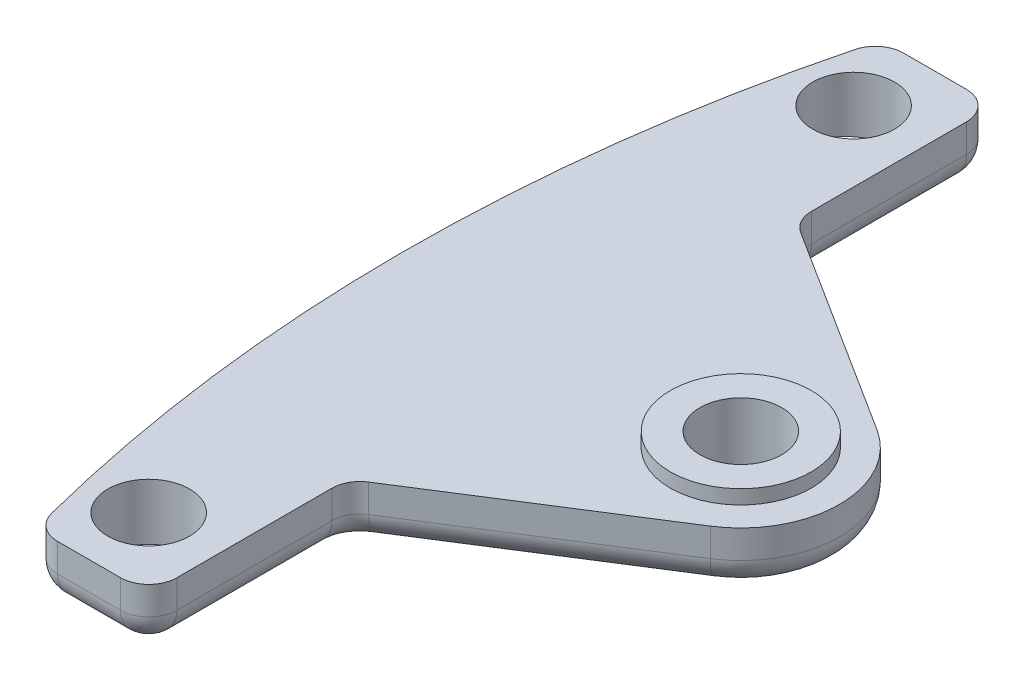
ISO-10303-21;
HEADER;
FILE_DESCRIPTION(('STEP AP214'),'2;1');
FILE_NAME('part.step','',(''),(''),'','','');
FILE_SCHEMA(('AUTOMOTIVE_DESIGN { 1 0 10303 214 1 1 1 1 }'));
ENDSEC;
DATA;
#1=APPLICATION_CONTEXT('core data for automotive mechanical design processes');
#2=APPLICATION_PROTOCOL_DEFINITION('international standard','automotive_design',2000,#1);
#3=PRODUCT_CONTEXT('',#1,'mechanical');
#4=PRODUCT('Part','Part','',(#3));
#5=PRODUCT_RELATED_PRODUCT_CATEGORY('part','',(#4));
#6=PRODUCT_DEFINITION_FORMATION('','',#4);
#7=PRODUCT_DEFINITION_CONTEXT('part definition',#1,'design');
#8=PRODUCT_DEFINITION('design','',#6,#7);
#9=PRODUCT_DEFINITION_SHAPE('','',#8);
#10=(LENGTH_UNIT() NAMED_UNIT(*) SI_UNIT(.MILLI.,.METRE.));
#11=(NAMED_UNIT(*) PLANE_ANGLE_UNIT() SI_UNIT($,.RADIAN.));
#12=(NAMED_UNIT(*) SI_UNIT($,.STERADIAN.) SOLID_ANGLE_UNIT());
#13=UNCERTAINTY_MEASURE_WITH_UNIT(LENGTH_MEASURE(1.E-05),#10,'distance_accuracy_value','');
#14=(GEOMETRIC_REPRESENTATION_CONTEXT(3) GLOBAL_UNCERTAINTY_ASSIGNED_CONTEXT((#13)) GLOBAL_UNIT_ASSIGNED_CONTEXT((#10,
#11,#12)) REPRESENTATION_CONTEXT('',''));
#15=CARTESIAN_POINT('',(0.,0.,0.));
#16=DIRECTION('',(0.,0.,1.));
#17=DIRECTION('',(1.,0.,0.));
#18=AXIS2_PLACEMENT_3D('',#15,#16,#17);
#19=CARTESIAN_POINT('',(0.,2.,0.));
#20=DIRECTION('',(0.,1.,0.));
#21=DIRECTION('',(0.,0.,1.));
#22=AXIS2_PLACEMENT_3D('',#19,#20,#21);
#23=PLANE('',#22);
#24=CARTESIAN_POINT('',(-8.5,2.,-12.5));
#25=DIRECTION('',(0.,1.,0.));
#26=DIRECTION('',(0.,0.,1.));
#27=AXIS2_PLACEMENT_3D('',#24,#25,#26);
#28=CIRCLE('',#27,1.45);
#29=CARTESIAN_POINT('',(-8.5,2.,-11.05));
#30=VERTEX_POINT('',#29);
#31=EDGE_CURVE('E234',#30,#30,#28,.T.);
#32=ORIENTED_EDGE('',*,*,#31,.F.);
#33=EDGE_LOOP('',(#32));
#34=FACE_BOUND('',#33,.T.);
#35=CARTESIAN_POINT('',(-8.5,2.,12.5));
#36=DIRECTION('',(0.,1.,0.));
#37=DIRECTION('',(0.,0.,1.));
#38=AXIS2_PLACEMENT_3D('',#35,#36,#37);
#39=CIRCLE('',#38,1.45);
#40=CARTESIAN_POINT('',(-8.5,2.,13.95));
#41=VERTEX_POINT('',#40);
#42=EDGE_CURVE('E523',#41,#41,#39,.T.);
#43=ORIENTED_EDGE('',*,*,#42,.F.);
#44=EDGE_LOOP('',(#43));
#45=FACE_BOUND('',#44,.T.);
#46=DIRECTION('',(1.,0.,0.));
#47=VECTOR('',#46,1.);
#48=CARTESIAN_POINT('',(-10.,2.,15.));
#49=LINE('',#48,#47);
#50=CARTESIAN_POINT('',(-9.22992749628068,2.,15.));
#51=VERTEX_POINT('',#50);
#52=CARTESIAN_POINT('',(-7.,2.,15.));
#53=VERTEX_POINT('',#52);
#54=EDGE_CURVE('E490',#51,#53,#49,.T.);
#55=ORIENTED_EDGE('',*,*,#54,.T.);
#56=CARTESIAN_POINT('',(-7.,2.,14.));
#57=DIRECTION('',(0.,1.,0.));
#58=DIRECTION('',(0.,0.,1.));
#59=AXIS2_PLACEMENT_3D('',#56,#57,#58);
#60=CIRCLE('',#59,1.);
#61=CARTESIAN_POINT('',(-6.,2.,14.));
#62=VERTEX_POINT('',#61);
#63=EDGE_CURVE('E310',#53,#62,#60,.T.);
#64=ORIENTED_EDGE('',*,*,#63,.T.);
#65=DIRECTION('',(0.,0.,-1.));
#66=VECTOR('',#65,1.);
#67=CARTESIAN_POINT('',(-6.,2.,15.));
#68=LINE('',#67,#66);
#69=CARTESIAN_POINT('',(-6.,2.,8.50448731510807));
#70=VERTEX_POINT('',#69);
#71=EDGE_CURVE('E495',#62,#70,#68,.T.);
#72=ORIENTED_EDGE('',*,*,#71,.T.);
#73=CARTESIAN_POINT('',(-5.,2.,8.50448731510807));
#74=DIRECTION('',(0.,1.,0.));
#75=DIRECTION('',(0.,0.,1.));
#76=AXIS2_PLACEMENT_3D('',#73,#74,#75);
#77=CIRCLE('',#76,1.);
#78=CARTESIAN_POINT('',(-5.53596548940221,2.,7.66024742374433));
#79=VERTEX_POINT('',#78);
#80=EDGE_CURVE('E55',#70,#79,#77,.F.);
#81=ORIENTED_EDGE('',*,*,#80,.T.);
#82=DIRECTION('',(0.844239891363734,0.,-0.53596548940221));
#83=VECTOR('',#82,1.);
#84=CARTESIAN_POINT('',(-6.,2.,7.95483961977326));
#85=LINE('',#84,#83);
#86=CARTESIAN_POINT('',(1.87587921290753,2.,2.95483961977326));
#87=VERTEX_POINT('',#86);
#88=EDGE_CURVE('E208',#79,#87,#85,.T.);
#89=ORIENTED_EDGE('',*,*,#88,.T.);
#90=CARTESIAN_POINT('',(0.,2.,0.));
#91=DIRECTION('',(0.,1.,0.));
#92=DIRECTION('',(0.,0.,1.));
#93=AXIS2_PLACEMENT_3D('',#90,#91,#92);
#94=CIRCLE('',#93,3.50000000000005);
#95=CARTESIAN_POINT('',(1.87587921290753,2.,-2.95483961977326));
#96=VERTEX_POINT('',#95);
#97=EDGE_CURVE('E202',#87,#96,#94,.T.);
#98=ORIENTED_EDGE('',*,*,#97,.T.);
#99=DIRECTION('',(-0.844239891363734,0.,-0.53596548940221));
#100=VECTOR('',#99,1.);
#101=CARTESIAN_POINT('',(1.87587921290753,2.,-2.95483961977326));
#102=LINE('',#101,#100);
#103=CARTESIAN_POINT('',(-5.53596548940221,2.,-7.66024742374434));
#104=VERTEX_POINT('',#103);
#105=EDGE_CURVE('E190',#96,#104,#102,.T.);
#106=ORIENTED_EDGE('',*,*,#105,.T.);
#107=CARTESIAN_POINT('',(-5.,2.,-8.50448731510807));
#108=DIRECTION('',(0.,1.,0.));
#109=DIRECTION('',(0.,0.,1.));
#110=AXIS2_PLACEMENT_3D('',#107,#108,#109);
#111=CIRCLE('',#110,1.);
#112=CARTESIAN_POINT('',(-6.,2.,-8.50448731510807));
#113=VERTEX_POINT('',#112);
#114=EDGE_CURVE('E11',#104,#113,#111,.F.);
#115=ORIENTED_EDGE('',*,*,#114,.T.);
#116=DIRECTION('',(0.,0.,-1.));
#117=VECTOR('',#116,1.);
#118=CARTESIAN_POINT('',(-6.,2.,-7.95483961977326));
#119=LINE('',#118,#117);
#120=CARTESIAN_POINT('',(-6.,2.,-14.));
#121=VERTEX_POINT('',#120);
#122=EDGE_CURVE('E201',#113,#121,#119,.T.);
#123=ORIENTED_EDGE('',*,*,#122,.T.);
#124=CARTESIAN_POINT('',(-7.,2.,-14.));
#125=DIRECTION('',(0.,1.,0.));
#126=DIRECTION('',(0.,0.,1.));
#127=AXIS2_PLACEMENT_3D('',#124,#125,#126);
#128=CIRCLE('',#127,1.);
#129=CARTESIAN_POINT('',(-7.,2.,-15.));
#130=VERTEX_POINT('',#129);
#131=EDGE_CURVE('E307',#121,#130,#128,.T.);
#132=ORIENTED_EDGE('',*,*,#131,.T.);
#133=DIRECTION('',(-1.,0.,0.));
#134=VECTOR('',#133,1.);
#135=CARTESIAN_POINT('',(-6.,2.,-15.));
#136=LINE('',#135,#134);
#137=CARTESIAN_POINT('',(-9.22992749628068,2.,-15.));
#138=VERTEX_POINT('',#137);
#139=EDGE_CURVE('E496',#130,#138,#136,.T.);
#140=ORIENTED_EDGE('',*,*,#139,.T.);
#141=CARTESIAN_POINT('',(-9.22992749628068,2.,-14.));
#142=DIRECTION('',(0.,1.,0.));
#143=DIRECTION('',(0.,0.,1.));
#144=AXIS2_PLACEMENT_3D('',#141,#142,#143);
#145=CIRCLE('',#144,1.);
#146=CARTESIAN_POINT('',(-10.198459540659,2.,-14.2488888888889));
#147=VERTEX_POINT('',#146);
#148=EDGE_CURVE('E301',#138,#147,#145,.T.);
#149=ORIENTED_EDGE('',*,*,#148,.T.);
#150=CARTESIAN_POINT('',(45.2500000000001,2.,0.));
#151=DIRECTION('',(0.,1.,0.));
#152=DIRECTION('',(0.,0.,1.));
#153=AXIS2_PLACEMENT_3D('',#150,#151,#152);
#154=CIRCLE('',#153,57.2500000000001);
#155=CARTESIAN_POINT('',(-10.198459540659,2.,14.2488888888889));
#156=VERTEX_POINT('',#155);
#157=EDGE_CURVE('E492',#147,#156,#154,.T.);
#158=ORIENTED_EDGE('',*,*,#157,.T.);
#159=CARTESIAN_POINT('',(-9.22992749628068,2.,14.));
#160=DIRECTION('',(0.,1.,0.));
#161=DIRECTION('',(0.,0.,1.));
#162=AXIS2_PLACEMENT_3D('',#159,#160,#161);
#163=CIRCLE('',#162,1.);
#164=EDGE_CURVE('E304',#156,#51,#163,.T.);
#165=ORIENTED_EDGE('',*,*,#164,.T.);
#166=EDGE_LOOP('',(#55,#64,#72,#81,#89,#98,#106,#115,#123,#132,#140,#149,#158,#165));
#167=FACE_BOUND('',#166,.T.);
#168=CARTESIAN_POINT('',(0.,2.,0.));
#169=DIRECTION('',(0.,1.,0.));
#170=DIRECTION('',(0.,0.,1.));
#171=AXIS2_PLACEMENT_3D('',#168,#169,#170);
#172=CIRCLE('',#171,2.5);
#173=CARTESIAN_POINT('',(0.,2.,2.5));
#174=VERTEX_POINT('',#173);
#175=EDGE_CURVE('E513',#174,#174,#172,.T.);
#176=ORIENTED_EDGE('',*,*,#175,.F.);
#177=EDGE_LOOP('',(#176));
#178=FACE_BOUND('',#177,.T.);
#179=ADVANCED_FACE('F45',(#34,#45,#167,#178),#23,.T.);
#180=CARTESIAN_POINT('',(0.,0.,0.));
#181=DIRECTION('',(0.,1.,0.));
#182=DIRECTION('',(0.,0.,1.));
#183=AXIS2_PLACEMENT_3D('',#180,#181,#182);
#184=PLANE('',#183);
#185=CARTESIAN_POINT('',(-8.5,0.,12.5));
#186=DIRECTION('',(0.,1.,0.));
#187=DIRECTION('',(0.,0.,1.));
#188=AXIS2_PLACEMENT_3D('',#185,#186,#187);
#189=CIRCLE('',#188,1.45);
#190=CARTESIAN_POINT('',(-9.3045551150355,0.,13.7063130053473));
#191=VERTEX_POINT('',#190);
#192=CARTESIAN_POINT('',(-9.75428223745297,0.,11.7724863789522));
#193=VERTEX_POINT('',#192);
#194=EDGE_CURVE('E229',#191,#193,#189,.T.);
#195=ORIENTED_EDGE('',*,*,#194,.T.);
#196=CARTESIAN_POINT('',(45.2500000000001,0.,0.));
#197=DIRECTION('',(0.,1.,0.));
#198=DIRECTION('',(0.,0.,1.));
#199=AXIS2_PLACEMENT_3D('',#196,#197,#198);
#200=CIRCLE('',#199,56.2500000000001);
#201=CARTESIAN_POINT('',(-9.75428223745296,0.,-11.7724863789523));
#202=VERTEX_POINT('',#201);
#203=EDGE_CURVE('E278',#193,#202,#200,.F.);
#204=ORIENTED_EDGE('',*,*,#203,.T.);
#205=CARTESIAN_POINT('',(-8.5,0.,-12.5));
#206=DIRECTION('',(0.,1.,0.));
#207=DIRECTION('',(0.,0.,1.));
#208=AXIS2_PLACEMENT_3D('',#205,#206,#207);
#209=CIRCLE('',#208,1.45);
#210=CARTESIAN_POINT('',(-9.30455511503549,0.,-13.7063130053474));
#211=VERTEX_POINT('',#210);
#212=EDGE_CURVE('E233',#202,#211,#209,.T.);
#213=ORIENTED_EDGE('',*,*,#212,.T.);
#214=CARTESIAN_POINT('',(45.2500000000001,0.,0.));
#215=DIRECTION('',(0.,1.,0.));
#216=DIRECTION('',(0.,0.,1.));
#217=AXIS2_PLACEMENT_3D('',#214,#215,#216);
#218=CIRCLE('',#217,56.2500000000001);
#219=CARTESIAN_POINT('',(-9.22992749628068,0.,-14.));
#220=VERTEX_POINT('',#219);
#221=EDGE_CURVE('E242',#211,#220,#218,.F.);
#222=ORIENTED_EDGE('',*,*,#221,.T.);
#223=DIRECTION('',(-1.,0.,0.));
#224=VECTOR('',#223,1.);
#225=CARTESIAN_POINT('',(0.,0.,-14.));
#226=LINE('',#225,#224);
#227=CARTESIAN_POINT('',(-7.,0.,-14.));
#228=VERTEX_POINT('',#227);
#229=EDGE_CURVE('E245',#220,#228,#226,.F.);
#230=ORIENTED_EDGE('',*,*,#229,.T.);
#231=DIRECTION('',(0.,0.,-1.));
#232=VECTOR('',#231,1.);
#233=CARTESIAN_POINT('',(-7.,0.,0.));
#234=LINE('',#233,#232);
#235=CARTESIAN_POINT('',(-7.,0.,-8.50448731510807));
#236=VERTEX_POINT('',#235);
#237=EDGE_CURVE('E248',#228,#236,#234,.F.);
#238=ORIENTED_EDGE('',*,*,#237,.T.);
#239=CARTESIAN_POINT('',(-5.,0.,-8.50448731510807));
#240=DIRECTION('',(0.,1.,0.));
#241=DIRECTION('',(0.,0.,1.));
#242=AXIS2_PLACEMENT_3D('',#239,#240,#241);
#243=CIRCLE('',#242,2.);
#244=CARTESIAN_POINT('',(-6.07193097880442,0.,-6.8160075323806));
#245=VERTEX_POINT('',#244);
#246=EDGE_CURVE('E251',#245,#236,#243,.F.);
#247=ORIENTED_EDGE('',*,*,#246,.F.);
#248=DIRECTION('',(-0.844239891363734,0.,-0.53596548940221));
#249=VECTOR('',#248,1.);
#250=CARTESIAN_POINT('',(1.33991372350555,0.,-2.11059972840938));
#251=LINE('',#250,#249);
#252=CARTESIAN_POINT('',(1.33991372350538,0.,-2.11059972840948));
#253=VERTEX_POINT('',#252);
#254=EDGE_CURVE('E255',#245,#253,#251,.F.);
#255=ORIENTED_EDGE('',*,*,#254,.T.);
#256=CARTESIAN_POINT('',(0.,0.,0.));
#257=DIRECTION('',(0.,1.,0.));
#258=DIRECTION('',(0.,0.,1.));
#259=AXIS2_PLACEMENT_3D('',#256,#257,#258);
#260=CIRCLE('',#259,2.50000000000005);
#261=CARTESIAN_POINT('',(1.33991372350532,0.,2.11059972840952));
#262=VERTEX_POINT('',#261);
#263=EDGE_CURVE('E258',#253,#262,#260,.F.);
#264=ORIENTED_EDGE('',*,*,#263,.T.);
#265=DIRECTION('',(0.844239891363734,0.,-0.53596548940221));
#266=VECTOR('',#265,1.);
#267=CARTESIAN_POINT('',(1.33991372350555,0.,2.11059972840937));
#268=LINE('',#267,#266);
#269=CARTESIAN_POINT('',(-6.07193097880442,0.,6.8160075323806));
#270=VERTEX_POINT('',#269);
#271=EDGE_CURVE('E261',#262,#270,#268,.F.);
#272=ORIENTED_EDGE('',*,*,#271,.T.);
#273=CARTESIAN_POINT('',(-5.,0.,8.50448731510807));
#274=DIRECTION('',(0.,1.,0.));
#275=DIRECTION('',(0.,0.,1.));
#276=AXIS2_PLACEMENT_3D('',#273,#274,#275);
#277=CIRCLE('',#276,2.);
#278=CARTESIAN_POINT('',(-7.,0.,8.50448731510807));
#279=VERTEX_POINT('',#278);
#280=EDGE_CURVE('E265',#279,#270,#277,.F.);
#281=ORIENTED_EDGE('',*,*,#280,.F.);
#282=DIRECTION('',(0.,0.,-1.));
#283=VECTOR('',#282,1.);
#284=CARTESIAN_POINT('',(-7.,0.,0.));
#285=LINE('',#284,#283);
#286=CARTESIAN_POINT('',(-7.,0.,14.));
#287=VERTEX_POINT('',#286);
#288=EDGE_CURVE('E269',#279,#287,#285,.F.);
#289=ORIENTED_EDGE('',*,*,#288,.T.);
#290=DIRECTION('',(1.,0.,0.));
#291=VECTOR('',#290,1.);
#292=CARTESIAN_POINT('',(0.,0.,14.));
#293=LINE('',#292,#291);
#294=CARTESIAN_POINT('',(-9.22992749628068,0.,14.));
#295=VERTEX_POINT('',#294);
#296=EDGE_CURVE('E272',#287,#295,#293,.F.);
#297=ORIENTED_EDGE('',*,*,#296,.T.);
#298=CARTESIAN_POINT('',(45.2500000000001,0.,0.));
#299=DIRECTION('',(0.,1.,0.));
#300=DIRECTION('',(0.,0.,1.));
#301=AXIS2_PLACEMENT_3D('',#298,#299,#300);
#302=CIRCLE('',#301,56.2500000000001);
#303=EDGE_CURVE('E275',#295,#191,#302,.F.);
#304=ORIENTED_EDGE('',*,*,#303,.T.);
#305=EDGE_LOOP('',(#195,#204,#213,#222,#230,#238,#247,#255,#264,#272,#281,#289,#297,#304));
#306=FACE_BOUND('',#305,.T.);
#307=CARTESIAN_POINT('',(0.,0.,0.));
#308=DIRECTION('',(0.,1.,0.));
#309=DIRECTION('',(0.,0.,1.));
#310=AXIS2_PLACEMENT_3D('',#307,#308,#309);
#311=CIRCLE('',#310,1.45);
#312=CARTESIAN_POINT('',(0.,0.,1.45));
#313=VERTEX_POINT('',#312);
#314=EDGE_CURVE('E213',#313,#313,#311,.T.);
#315=ORIENTED_EDGE('',*,*,#314,.T.);
#316=EDGE_LOOP('',(#315));
#317=FACE_BOUND('',#316,.T.);
#318=ADVANCED_FACE('F385',(#306,#317),#184,.F.);
#319=CARTESIAN_POINT('',(0.,2.,0.));
#320=DIRECTION('',(0.,-1.,0.));
#321=DIRECTION('',(0.,0.,-1.));
#322=AXIS2_PLACEMENT_3D('',#319,#320,#321);
#323=CYLINDRICAL_SURFACE('',#322,3.50000000000005);
#324=DIRECTION('',(0.,-1.,0.));
#325=VECTOR('',#324,1.);
#326=CARTESIAN_POINT('',(1.87587921290753,2.,2.95483961977326));
#327=LINE('',#326,#325);
#328=CARTESIAN_POINT('',(1.87587921290753,1.,2.95483961977326));
#329=VERTEX_POINT('',#328);
#330=EDGE_CURVE('E220',#87,#329,#327,.T.);
#331=ORIENTED_EDGE('',*,*,#330,.T.);
#332=CARTESIAN_POINT('',(0.,1.,0.));
#333=DIRECTION('',(0.,1.,0.));
#334=DIRECTION('',(0.,0.,1.));
#335=AXIS2_PLACEMENT_3D('',#332,#333,#334);
#336=CIRCLE('',#335,3.50000000000005);
#337=CARTESIAN_POINT('',(1.87587921290753,1.,-2.95483961977326));
#338=VERTEX_POINT('',#337);
#339=EDGE_CURVE('E217',#329,#338,#336,.T.);
#340=ORIENTED_EDGE('',*,*,#339,.T.);
#341=DIRECTION('',(0.,-1.,0.));
#342=VECTOR('',#341,1.);
#343=CARTESIAN_POINT('',(1.87587921290753,2.,-2.95483961977326));
#344=LINE('',#343,#342);
#345=EDGE_CURVE('E194',#96,#338,#344,.T.);
#346=ORIENTED_EDGE('',*,*,#345,.F.);
#347=ORIENTED_EDGE('',*,*,#97,.F.);
#348=EDGE_LOOP('',(#331,#340,#346,#347));
#349=FACE_BOUND('',#348,.T.);
#350=ADVANCED_FACE('F215',(#349),#323,.T.);
#351=CARTESIAN_POINT('',(1.87587921290753,2.,-2.95483961977326));
#352=DIRECTION('',(-0.53596548940221,0.,0.844239891363734));
#353=DIRECTION('',(0.844239891363734,0.,0.53596548940221));
#354=AXIS2_PLACEMENT_3D('',#351,#352,#353);
#355=PLANE('',#354);
#356=DIRECTION('',(-0.844239891363734,0.,-0.53596548940221));
#357=VECTOR('',#356,1.);
#358=CARTESIAN_POINT('',(1.87587921290753,1.,-2.95483961977326));
#359=LINE('',#358,#357);
#360=CARTESIAN_POINT('',(-5.53596548940221,1.,-7.66024742374434));
#361=VERTEX_POINT('',#360);
#362=EDGE_CURVE('E322',#338,#361,#359,.T.);
#363=ORIENTED_EDGE('',*,*,#362,.T.);
#364=DIRECTION('',(0.,-1.,0.));
#365=VECTOR('',#364,1.);
#366=CARTESIAN_POINT('',(-5.53596548940221,2.,-7.66024742374434));
#367=LINE('',#366,#365);
#368=EDGE_CURVE('E197',#361,#104,#367,.F.);
#369=ORIENTED_EDGE('',*,*,#368,.T.);
#370=ORIENTED_EDGE('',*,*,#105,.F.);
#371=ORIENTED_EDGE('',*,*,#345,.T.);
#372=EDGE_LOOP('',(#363,#369,#370,#371));
#373=FACE_BOUND('',#372,.T.);
#374=ADVANCED_FACE('F192',(#373),#355,.F.);
#375=CARTESIAN_POINT('',(-6.,2.,-7.95483961977326));
#376=DIRECTION('',(-1.,0.,0.));
#377=DIRECTION('',(0.,0.,1.));
#378=AXIS2_PLACEMENT_3D('',#375,#376,#377);
#379=PLANE('',#378);
#380=ORIENTED_EDGE('',*,*,#122,.F.);
#381=DIRECTION('',(0.,-1.,0.));
#382=VECTOR('',#381,1.);
#383=CARTESIAN_POINT('',(-6.,0.,-8.50448731510807));
#384=LINE('',#383,#382);
#385=CARTESIAN_POINT('',(-6.,1.,-8.50448731510807));
#386=VERTEX_POINT('',#385);
#387=EDGE_CURVE('E319',#113,#386,#384,.T.);
#388=ORIENTED_EDGE('',*,*,#387,.T.);
#389=DIRECTION('',(0.,0.,-1.));
#390=VECTOR('',#389,1.);
#391=CARTESIAN_POINT('',(-6.,1.,-7.95483961977326));
#392=LINE('',#391,#390);
#393=CARTESIAN_POINT('',(-6.,1.,-14.));
#394=VERTEX_POINT('',#393);
#395=EDGE_CURVE('E316',#386,#394,#392,.T.);
#396=ORIENTED_EDGE('',*,*,#395,.T.);
#397=DIRECTION('',(0.,-1.,0.));
#398=VECTOR('',#397,1.);
#399=CARTESIAN_POINT('',(-6.,2.,-14.));
#400=LINE('',#399,#398);
#401=EDGE_CURVE('E313',#394,#121,#400,.F.);
#402=ORIENTED_EDGE('',*,*,#401,.T.);
#403=EDGE_LOOP('',(#380,#388,#396,#402));
#404=FACE_BOUND('',#403,.T.);
#405=ADVANCED_FACE('F404',(#404),#379,.F.);
#406=CARTESIAN_POINT('',(-6.,2.,-15.));
#407=DIRECTION('',(0.,0.,1.));
#408=DIRECTION('',(1.,0.,0.));
#409=AXIS2_PLACEMENT_3D('',#406,#407,#408);
#410=PLANE('',#409);
#411=ORIENTED_EDGE('',*,*,#139,.F.);
#412=DIRECTION('',(0.,-1.,0.));
#413=VECTOR('',#412,1.);
#414=CARTESIAN_POINT('',(-7.,2.,-15.));
#415=LINE('',#414,#413);
#416=CARTESIAN_POINT('',(-7.,1.,-15.));
#417=VERTEX_POINT('',#416);
#418=EDGE_CURVE('E333',#130,#417,#415,.T.);
#419=ORIENTED_EDGE('',*,*,#418,.T.);
#420=DIRECTION('',(-1.,0.,0.));
#421=VECTOR('',#420,1.);
#422=CARTESIAN_POINT('',(-6.,1.,-15.));
#423=LINE('',#422,#421);
#424=CARTESIAN_POINT('',(-9.22992749628068,1.,-15.));
#425=VERTEX_POINT('',#424);
#426=EDGE_CURVE('E327',#417,#425,#423,.T.);
#427=ORIENTED_EDGE('',*,*,#426,.T.);
#428=DIRECTION('',(0.,-1.,0.));
#429=VECTOR('',#428,1.);
#430=CARTESIAN_POINT('',(-9.22992749628068,2.,-15.));
#431=LINE('',#430,#429);
#432=EDGE_CURVE('E330',#425,#138,#431,.F.);
#433=ORIENTED_EDGE('',*,*,#432,.T.);
#434=EDGE_LOOP('',(#411,#419,#427,#433));
#435=FACE_BOUND('',#434,.T.);
#436=ADVANCED_FACE('F400',(#435),#410,.F.);
#437=CARTESIAN_POINT('',(-10.,2.,15.));
#438=DIRECTION('',(0.,0.,-1.));
#439=DIRECTION('',(-1.,0.,0.));
#440=AXIS2_PLACEMENT_3D('',#437,#438,#439);
#441=PLANE('',#440);
#442=DIRECTION('',(1.,0.,0.));
#443=VECTOR('',#442,1.);
#444=CARTESIAN_POINT('',(-10.,1.,15.));
#445=LINE('',#444,#443);
#446=CARTESIAN_POINT('',(-9.22992749628068,1.,15.));
#447=VERTEX_POINT('',#446);
#448=CARTESIAN_POINT('',(-7.,1.,15.));
#449=VERTEX_POINT('',#448);
#450=EDGE_CURVE('E292',#447,#449,#445,.T.);
#451=ORIENTED_EDGE('',*,*,#450,.T.);
#452=DIRECTION('',(0.,-1.,0.));
#453=VECTOR('',#452,1.);
#454=CARTESIAN_POINT('',(-7.,2.,15.));
#455=LINE('',#454,#453);
#456=EDGE_CURVE('E298',#449,#53,#455,.F.);
#457=ORIENTED_EDGE('',*,*,#456,.T.);
#458=ORIENTED_EDGE('',*,*,#54,.F.);
#459=DIRECTION('',(0.,-1.,0.));
#460=VECTOR('',#459,1.);
#461=CARTESIAN_POINT('',(-9.22992749628068,0.,15.));
#462=LINE('',#461,#460);
#463=EDGE_CURVE('E295',#51,#447,#462,.T.);
#464=ORIENTED_EDGE('',*,*,#463,.T.);
#465=EDGE_LOOP('',(#451,#457,#458,#464));
#466=FACE_BOUND('',#465,.T.);
#467=ADVANCED_FACE('F396',(#466),#441,.F.);
#468=CARTESIAN_POINT('',(-6.,2.,15.));
#469=DIRECTION('',(-1.,0.,0.));
#470=DIRECTION('',(0.,0.,1.));
#471=AXIS2_PLACEMENT_3D('',#468,#469,#470);
#472=PLANE('',#471);
#473=ORIENTED_EDGE('',*,*,#71,.F.);
#474=DIRECTION('',(0.,-1.,0.));
#475=VECTOR('',#474,1.);
#476=CARTESIAN_POINT('',(-6.,2.,14.));
#477=LINE('',#476,#475);
#478=CARTESIAN_POINT('',(-6.,1.,14.));
#479=VERTEX_POINT('',#478);
#480=EDGE_CURVE('E289',#62,#479,#477,.T.);
#481=ORIENTED_EDGE('',*,*,#480,.T.);
#482=DIRECTION('',(0.,0.,-1.));
#483=VECTOR('',#482,1.);
#484=CARTESIAN_POINT('',(-6.,1.,15.));
#485=LINE('',#484,#483);
#486=CARTESIAN_POINT('',(-6.,1.,8.50448731510807));
#487=VERTEX_POINT('',#486);
#488=EDGE_CURVE('E286',#479,#487,#485,.T.);
#489=ORIENTED_EDGE('',*,*,#488,.T.);
#490=DIRECTION('',(0.,-1.,0.));
#491=VECTOR('',#490,1.);
#492=CARTESIAN_POINT('',(-6.,2.,8.50448731510807));
#493=LINE('',#492,#491);
#494=EDGE_CURVE('E283',#487,#70,#493,.F.);
#495=ORIENTED_EDGE('',*,*,#494,.T.);
#496=EDGE_LOOP('',(#473,#481,#489,#495));
#497=FACE_BOUND('',#496,.T.);
#498=ADVANCED_FACE('F392',(#497),#472,.F.);
#499=CARTESIAN_POINT('',(-6.,2.,7.95483961977326));
#500=DIRECTION('',(-0.53596548940221,0.,-0.844239891363734));
#501=DIRECTION('',(-0.844239891363734,0.,0.53596548940221));
#502=AXIS2_PLACEMENT_3D('',#499,#500,#501);
#503=PLANE('',#502);
#504=DIRECTION('',(0.,-1.,0.));
#505=VECTOR('',#504,1.);
#506=CARTESIAN_POINT('',(-5.53596548940221,0.,7.66024742374433));
#507=LINE('',#506,#505);
#508=CARTESIAN_POINT('',(-5.53596548940221,1.,7.66024742374433));
#509=VERTEX_POINT('',#508);
#510=EDGE_CURVE('E219',#79,#509,#507,.T.);
#511=ORIENTED_EDGE('',*,*,#510,.T.);
#512=DIRECTION('',(0.844239891363734,0.,-0.53596548940221));
#513=VECTOR('',#512,1.);
#514=CARTESIAN_POINT('',(-6.,1.,7.95483961977326));
#515=LINE('',#514,#513);
#516=EDGE_CURVE('E224',#509,#329,#515,.T.);
#517=ORIENTED_EDGE('',*,*,#516,.T.);
#518=ORIENTED_EDGE('',*,*,#330,.F.);
#519=ORIENTED_EDGE('',*,*,#88,.F.);
#520=EDGE_LOOP('',(#511,#517,#518,#519));
#521=FACE_BOUND('',#520,.T.);
#522=ADVANCED_FACE('F381',(#521),#503,.F.);
#523=CARTESIAN_POINT('',(0.,2.,0.));
#524=DIRECTION('',(0.,-1.,0.));
#525=DIRECTION('',(0.,0.,-1.));
#526=AXIS2_PLACEMENT_3D('',#523,#524,#525);
#527=CYLINDRICAL_SURFACE('',#526,1.45);
#528=ORIENTED_EDGE('',*,*,#314,.F.);
#529=EDGE_LOOP('',(#528));
#530=FACE_BOUND('',#529,.T.);
#531=CARTESIAN_POINT('',(0.,2.5,0.));
#532=DIRECTION('',(0.,1.,0.));
#533=DIRECTION('',(0.,0.,1.));
#534=AXIS2_PLACEMENT_3D('',#531,#532,#533);
#535=CIRCLE('',#534,1.45);
#536=CARTESIAN_POINT('',(0.,2.5,1.45));
#537=VERTEX_POINT('',#536);
#538=EDGE_CURVE('E237',#537,#537,#535,.T.);
#539=ORIENTED_EDGE('',*,*,#538,.T.);
#540=EDGE_LOOP('',(#539));
#541=FACE_BOUND('',#540,.T.);
#542=ADVANCED_FACE('F374',(#530,#541),#527,.F.);
#543=CARTESIAN_POINT('',(0.,2.5,0.));
#544=DIRECTION('',(0.,1.,0.));
#545=DIRECTION('',(0.,0.,1.));
#546=AXIS2_PLACEMENT_3D('',#543,#544,#545);
#547=PLANE('',#546);
#548=CARTESIAN_POINT('',(0.,2.5,0.));
#549=DIRECTION('',(0.,1.,0.));
#550=DIRECTION('',(0.,0.,1.));
#551=AXIS2_PLACEMENT_3D('',#548,#549,#550);
#552=CIRCLE('',#551,2.5);
#553=CARTESIAN_POINT('',(0.,2.5,2.5));
#554=VERTEX_POINT('',#553);
#555=EDGE_CURVE('E512',#554,#554,#552,.T.);
#556=ORIENTED_EDGE('',*,*,#555,.T.);
#557=EDGE_LOOP('',(#556));
#558=FACE_BOUND('',#557,.T.);
#559=ORIENTED_EDGE('',*,*,#538,.F.);
#560=EDGE_LOOP('',(#559));
#561=FACE_BOUND('',#560,.T.);
#562=ADVANCED_FACE('F371',(#558,#561),#547,.T.);
#563=CARTESIAN_POINT('',(0.,2.5,0.));
#564=DIRECTION('',(0.,-1.,0.));
#565=DIRECTION('',(0.,0.,-1.));
#566=AXIS2_PLACEMENT_3D('',#563,#564,#565);
#567=CYLINDRICAL_SURFACE('',#566,2.5);
#568=ORIENTED_EDGE('',*,*,#555,.F.);
#569=EDGE_LOOP('',(#568));
#570=FACE_BOUND('',#569,.T.);
#571=ORIENTED_EDGE('',*,*,#175,.T.);
#572=EDGE_LOOP('',(#571));
#573=FACE_BOUND('',#572,.T.);
#574=ADVANCED_FACE('F367',(#570,#573),#567,.T.);
#575=CARTESIAN_POINT('',(-8.5,-8.,12.5));
#576=DIRECTION('',(0.,1.,0.));
#577=DIRECTION('',(0.,0.,1.));
#578=AXIS2_PLACEMENT_3D('',#575,#576,#577);
#579=CYLINDRICAL_SURFACE('',#578,1.45);
#580=ORIENTED_EDGE('',*,*,#42,.T.);
#581=EDGE_LOOP('',(#580));
#582=FACE_BOUND('',#581,.T.);
#583=ORIENTED_EDGE('',*,*,#194,.F.);
#584=CARTESIAN_POINT('',(-9.3045551150355,0.,13.7063130053473));
#585=CARTESIAN_POINT('',(-9.34011445678407,6.27135933740755E-06,13.68259908112));
#586=CARTESIAN_POINT('',(-9.3745754674893,0.00123491697570643,13.6573404522793));
#587=CARTESIAN_POINT('',(-9.44104287696471,0.0054663735013227,13.6039711208604));
#588=CARTESIAN_POINT('',(-9.47305182827145,0.00846731034614631,13.5758634568913));
#589=CARTESIAN_POINT('',(-9.56507747095446,0.0191243755252918,13.4875864246474));
#590=CARTESIAN_POINT('',(-9.62114729366451,0.0284367866495872,13.4234265812054));
#591=CARTESIAN_POINT('',(-9.71683249640974,0.0459311394495145,13.2923541408225));
#592=CARTESIAN_POINT('',(-9.75745830326557,0.0541407029865506,13.226173523473));
#593=CARTESIAN_POINT('',(-9.82769257606595,0.0673570166623939,13.0879782883094));
#594=CARTESIAN_POINT('',(-9.85731827250943,0.0723687847303648,13.0159730115431));
#595=CARTESIAN_POINT('',(-9.90533627693927,0.0774732640106818,12.8659250725417));
#596=CARTESIAN_POINT('',(-9.92339714491286,0.0774268635990224,12.7877708172457));
#597=CARTESIAN_POINT('',(-9.9464033128143,0.072076278889375,12.6296562421921));
#598=CARTESIAN_POINT('',(-9.95133254455271,0.0667656640572636,12.5496938304128));
#599=CARTESIAN_POINT('',(-9.94811623693245,0.0531794970649339,12.3936790008529));
#600=CARTESIAN_POINT('',(-9.94050236896162,0.0450354795518743,12.3176015107875));
#601=CARTESIAN_POINT('',(-9.9134536784831,0.0286041231082151,12.1676802076907));
#602=CARTESIAN_POINT('',(-9.89403667243111,0.0203170184456653,12.0938332038249));
#603=CARTESIAN_POINT('',(-9.85382576490183,0.00966193016304153,11.9787068011922));
#604=CARTESIAN_POINT('',(-9.83669365243728,0.00625241645370272,11.9362226402609));
#605=CARTESIAN_POINT('',(-9.79844427796028,0.00142587094386871,11.8529726320907));
#606=CARTESIAN_POINT('',(-9.77732668711736,9.00363253996161E-06,11.8122069269764));
#607=CARTESIAN_POINT('',(-9.75428223745297,0.,11.7724863789522));
#608=B_SPLINE_CURVE_WITH_KNOTS('',3,(#584,#585,#586,#587,#588,#589,#590,#591,#592,#593,#594,
#595,#596,#597,#598,#599,#600,#601,#602,#603,#604,#605,#606,#607),.UNSPECIFIED.,.F.,.F.,(4,2,2,
2,2,2,2,2,2,2,2,4),(0.,0.12807187838121,0.256008572270948,0.511688632403037,0.744998701611827,
0.977941758156867,1.21729287475609,1.45693673296838,1.68668157674233,1.91608048627962,
2.05366138362438,2.1912536373438),.UNSPECIFIED.);
#609=EDGE_CURVE('E343',#191,#193,#608,.T.);
#610=ORIENTED_EDGE('',*,*,#609,.T.);
#611=EDGE_LOOP('',(#583,#610));
#612=FACE_BOUND('',#611,.T.);
#613=ADVANCED_FACE('F362',(#582,#612),#579,.F.);
#614=CARTESIAN_POINT('',(-8.5,-8.,-12.5));
#615=DIRECTION('',(0.,1.,0.));
#616=DIRECTION('',(0.,0.,1.));
#617=AXIS2_PLACEMENT_3D('',#614,#615,#616);
#618=CYLINDRICAL_SURFACE('',#617,1.45);
#619=ORIENTED_EDGE('',*,*,#31,.T.);
#620=EDGE_LOOP('',(#619));
#621=FACE_BOUND('',#620,.T.);
#622=ORIENTED_EDGE('',*,*,#212,.F.);
#623=CARTESIAN_POINT('',(-9.75428223745296,0.,-11.7724863789523));
#624=CARTESIAN_POINT('',(-9.77572878126147,6.27135933753896E-06,-11.8094574858672));
#625=CARTESIAN_POINT('',(-9.79550809728013,0.00123491697570618,-11.8473301441787));
#626=CARTESIAN_POINT('',(-9.83160551859994,0.00546637350132165,-11.924551761829));
#627=CARTESIAN_POINT('',(-9.84792725529671,0.00846731034614489,-11.9638991206827));
#628=CARTESIAN_POINT('',(-9.89155711744288,0.0191243755252907,-12.0837239447472));
#629=CARTESIAN_POINT('',(-9.91356258412308,0.028436786649588,-12.1660408322335));
#630=CARTESIAN_POINT('',(-9.9415929180749,0.0459311394495155,-12.3258843276623));
#631=CARTESIAN_POINT('',(-9.9488475128775,0.0541407029865501,-12.4031999221417));
#632=CARTESIAN_POINT('',(-9.95089566110081,0.0673570166623943,-12.5582050226595));
#633=CARTESIAN_POINT('',(-9.94570879863834,0.0723687847303674,-12.6358937491888));
#634=CARTESIAN_POINT('',(-9.9225904108531,0.0774732640106851,-12.7917322967123));
#635=CARTESIAN_POINT('',(-9.90431221615387,0.0774268635990243,-12.8698360109093));
#636=CARTESIAN_POINT('',(-9.85518920595047,0.0720762788893738,-13.0218769017066));
#637=CARTESIAN_POINT('',(-9.82432904801321,0.0667656640572606,-13.0958088655327));
#638=CARTESIAN_POINT('',(-9.7526009436267,0.0531794970649322,-13.2343947620677));
#639=CARTESIAN_POINT('',(-9.71219904699392,0.0450354795518755,-13.2993057952486));
#640=CARTESIAN_POINT('',(-9.62177294113957,0.0286041231082177,-13.421907378268));
#641=CARTESIAN_POINT('',(-9.57176331214545,0.0203170184456666,-13.4796086530533));
#642=CARTESIAN_POINT('',(-9.48487896964528,0.00966193016304203,-13.5651780207954));
#643=CARTESIAN_POINT('',(-9.45075868072716,0.00625241645370321,-13.5957430186145));
#644=CARTESIAN_POINT('',(-9.37970010556726,0.00142587094386919,-13.6535725733808));
#645=CARTESIAN_POINT('',(-9.34276158695128,9.00363254045857E-06,-13.6808368576906));
#646=CARTESIAN_POINT('',(-9.30455511503549,0.,-13.7063130053474));
#647=B_SPLINE_CURVE_WITH_KNOTS('',3,(#623,#624,#625,#626,#627,#628,#629,#630,#631,#632,#633,
#634,#635,#636,#637,#638,#639,#640,#641,#642,#643,#644,#645,#646),.UNSPECIFIED.,.F.,.F.,(4,2,2,
2,2,2,2,2,2,2,2,4),(0.,0.128071878381208,0.256008572270946,0.511688632403037,0.744998701611821,
0.977941758156864,1.21729287475609,1.45693673296838,1.68668157674233,1.91608048627962,
2.05366138362439,2.19125363734382),.UNSPECIFIED.);
#648=EDGE_CURVE('E352',#202,#211,#647,.T.);
#649=ORIENTED_EDGE('',*,*,#648,.T.);
#650=EDGE_LOOP('',(#622,#649));
#651=FACE_BOUND('',#650,.T.);
#652=ADVANCED_FACE('F366',(#621,#651),#618,.F.);
#653=CARTESIAN_POINT('',(45.2500000000001,-30.0665927567458,0.));
#654=DIRECTION('',(0.,1.,0.));
#655=DIRECTION('',(0.,0.,1.));
#656=AXIS2_PLACEMENT_3D('',#653,#654,#655);
#657=CYLINDRICAL_SURFACE('',#656,57.2500000000001);
#658=CARTESIAN_POINT('',(45.2500000000001,1.,0.));
#659=DIRECTION('',(0.,1.,0.));
#660=DIRECTION('',(0.,0.,1.));
#661=AXIS2_PLACEMENT_3D('',#658,#659,#660);
#662=CIRCLE('',#661,57.2500000000001);
#663=CARTESIAN_POINT('',(-10.198459540659,1.,-14.2488888888889));
#664=VERTEX_POINT('',#663);
#665=CARTESIAN_POINT('',(-10.198459540659,1.,14.2488888888889));
#666=VERTEX_POINT('',#665);
#667=EDGE_CURVE('E63',#664,#666,#662,.T.);
#668=ORIENTED_EDGE('',*,*,#667,.T.);
#669=DIRECTION('',(0.,1.,0.));
#670=VECTOR('',#669,1.);
#671=CARTESIAN_POINT('',(-10.198459540659,-30.0665927567458,14.2488888888889));
#672=LINE('',#671,#670);
#673=EDGE_CURVE('E340',#666,#156,#672,.T.);
#674=ORIENTED_EDGE('',*,*,#673,.T.);
#675=ORIENTED_EDGE('',*,*,#157,.F.);
#676=DIRECTION('',(0.,1.,0.));
#677=VECTOR('',#676,1.);
#678=CARTESIAN_POINT('',(-10.198459540659,-30.0665927567458,-14.2488888888889));
#679=LINE('',#678,#677);
#680=EDGE_CURVE('E68',#147,#664,#679,.F.);
#681=ORIENTED_EDGE('',*,*,#680,.T.);
#682=EDGE_LOOP('',(#668,#674,#675,#681));
#683=FACE_BOUND('',#682,.T.);
#684=ADVANCED_FACE('F662',(#683),#657,.T.);
#685=CARTESIAN_POINT('',(-9.22992749628068,-30.0665927567458,-14.));
#686=DIRECTION('',(0.,1.,0.));
#687=DIRECTION('',(0.,0.,1.));
#688=AXIS2_PLACEMENT_3D('',#685,#686,#687);
#689=CYLINDRICAL_SURFACE('',#688,1.);
#690=CARTESIAN_POINT('',(-9.22992749628068,1.,-14.));
#691=DIRECTION('',(0.,-1.,0.));
#692=DIRECTION('',(0.,0.,-1.));
#693=AXIS2_PLACEMENT_3D('',#690,#691,#692);
#694=CIRCLE('',#693,1.);
#695=EDGE_CURVE('E49',#664,#425,#694,.T.);
#696=ORIENTED_EDGE('',*,*,#695,.F.);
#697=ORIENTED_EDGE('',*,*,#680,.F.);
#698=ORIENTED_EDGE('',*,*,#148,.F.);
#699=ORIENTED_EDGE('',*,*,#432,.F.);
#700=EDGE_LOOP('',(#696,#697,#698,#699));
#701=FACE_BOUND('',#700,.T.);
#702=ADVANCED_FACE('F47',(#701),#689,.T.);
#703=CARTESIAN_POINT('',(-9.22992749628069,1.,-14.));
#704=DIRECTION('',(0.,-1.,0.));
#705=DIRECTION('',(1.,0.,0.));
#706=AXIS2_PLACEMENT_3D('',#703,#704,#705);
#707=SPHERICAL_SURFACE('',#706,1.);
#708=CARTESIAN_POINT('',(-9.22992749628068,1.,-14.));
#709=DIRECTION('',(-1.,0.,0.));
#710=DIRECTION('',(0.,0.,1.));
#711=AXIS2_PLACEMENT_3D('',#708,#709,#710);
#712=CIRCLE('',#711,1.);
#713=EDGE_CURVE('E540',#220,#425,#712,.F.);
#714=ORIENTED_EDGE('',*,*,#713,.F.);
#715=CARTESIAN_POINT('',(-9.22992749628068,1.,-14.));
#716=DIRECTION('',(0.24888888888889,0.,-0.968532044378323));
#717=DIRECTION('',(-0.968532044378323,0.,-0.24888888888889));
#718=AXIS2_PLACEMENT_3D('',#715,#716,#717);
#719=CIRCLE('',#718,1.);
#720=EDGE_CURVE('E533',#664,#220,#719,.F.);
#721=ORIENTED_EDGE('',*,*,#720,.F.);
#722=ORIENTED_EDGE('',*,*,#695,.T.);
#723=EDGE_LOOP('',(#714,#721,#722));
#724=FACE_BOUND('',#723,.T.);
#725=ADVANCED_FACE('F482',(#724),#707,.T.);
#726=CARTESIAN_POINT('',(45.2500000000001,1.,0.));
#727=DIRECTION('',(0.,1.,0.));
#728=DIRECTION('',(0.,0.,1.));
#729=AXIS2_PLACEMENT_3D('',#726,#727,#728);
#730=TOROIDAL_SURFACE('',#729,56.2500000000001,1.);
#731=ORIENTED_EDGE('',*,*,#609,.F.);
#732=ORIENTED_EDGE('',*,*,#303,.F.);
#733=CARTESIAN_POINT('',(-9.22992749628068,1.,14.));
#734=DIRECTION('',(0.248888888888889,0.,0.968532044378323));
#735=DIRECTION('',(0.968532044378323,0.,-0.248888888888889));
#736=AXIS2_PLACEMENT_3D('',#733,#734,#735);
#737=CIRCLE('',#736,1.);
#738=EDGE_CURVE('E543',#666,#295,#737,.T.);
#739=ORIENTED_EDGE('',*,*,#738,.F.);
#740=ORIENTED_EDGE('',*,*,#667,.F.);
#741=ORIENTED_EDGE('',*,*,#720,.T.);
#742=ORIENTED_EDGE('',*,*,#221,.F.);
#743=ORIENTED_EDGE('',*,*,#648,.F.);
#744=ORIENTED_EDGE('',*,*,#203,.F.);
#745=EDGE_LOOP('',(#731,#732,#739,#740,#741,#742,#743,#744));
#746=FACE_BOUND('',#745,.T.);
#747=ADVANCED_FACE('F359',(#746),#730,.T.);
#748=CARTESIAN_POINT('',(-9.22992749628068,-30.0665927567458,14.));
#749=DIRECTION('',(0.,1.,0.));
#750=DIRECTION('',(0.,0.,1.));
#751=AXIS2_PLACEMENT_3D('',#748,#749,#750);
#752=CYLINDRICAL_SURFACE('',#751,1.);
#753=ORIENTED_EDGE('',*,*,#164,.F.);
#754=ORIENTED_EDGE('',*,*,#673,.F.);
#755=CARTESIAN_POINT('',(-9.22992749628068,1.,14.));
#756=DIRECTION('',(0.,-1.,0.));
#757=DIRECTION('',(1.,0.,0.));
#758=AXIS2_PLACEMENT_3D('',#755,#756,#757);
#759=CIRCLE('',#758,1.);
#760=EDGE_CURVE('E549',#447,#666,#759,.T.);
#761=ORIENTED_EDGE('',*,*,#760,.F.);
#762=ORIENTED_EDGE('',*,*,#463,.F.);
#763=EDGE_LOOP('',(#753,#754,#761,#762));
#764=FACE_BOUND('',#763,.T.);
#765=ADVANCED_FACE('F475',(#764),#752,.T.);
#766=CARTESIAN_POINT('',(-7.,2.,-14.));
#767=DIRECTION('',(0.,-1.,0.));
#768=DIRECTION('',(0.,0.,-1.));
#769=AXIS2_PLACEMENT_3D('',#766,#767,#768);
#770=CYLINDRICAL_SURFACE('',#769,1.);
#771=ORIENTED_EDGE('',*,*,#131,.F.);
#772=ORIENTED_EDGE('',*,*,#401,.F.);
#773=CARTESIAN_POINT('',(-7.,1.,-14.));
#774=DIRECTION('',(0.,-1.,0.));
#775=DIRECTION('',(0.,0.,-1.));
#776=AXIS2_PLACEMENT_3D('',#773,#774,#775);
#777=CIRCLE('',#776,1.);
#778=EDGE_CURVE('E553',#417,#394,#777,.T.);
#779=ORIENTED_EDGE('',*,*,#778,.F.);
#780=ORIENTED_EDGE('',*,*,#418,.F.);
#781=EDGE_LOOP('',(#771,#772,#779,#780));
#782=FACE_BOUND('',#781,.T.);
#783=ADVANCED_FACE('F472',(#782),#770,.T.);
#784=CARTESIAN_POINT('',(-6.,1.,-14.));
#785=DIRECTION('',(-1.,0.,0.));
#786=DIRECTION('',(0.,0.,1.));
#787=AXIS2_PLACEMENT_3D('',#784,#785,#786);
#788=CYLINDRICAL_SURFACE('',#787,1.);
#789=ORIENTED_EDGE('',*,*,#713,.T.);
#790=ORIENTED_EDGE('',*,*,#426,.F.);
#791=CARTESIAN_POINT('',(-7.,1.,-14.));
#792=DIRECTION('',(1.,0.,0.));
#793=DIRECTION('',(0.,0.,-1.));
#794=AXIS2_PLACEMENT_3D('',#791,#792,#793);
#795=CIRCLE('',#794,1.);
#796=EDGE_CURVE('E557',#228,#417,#795,.T.);
#797=ORIENTED_EDGE('',*,*,#796,.F.);
#798=ORIENTED_EDGE('',*,*,#229,.F.);
#799=EDGE_LOOP('',(#789,#790,#797,#798));
#800=FACE_BOUND('',#799,.T.);
#801=ADVANCED_FACE('F468',(#800),#788,.T.);
#802=CARTESIAN_POINT('',(-9.22992749628068,1.,14.));
#803=DIRECTION('',(0.,-1.,0.));
#804=DIRECTION('',(0.,0.,-1.));
#805=AXIS2_PLACEMENT_3D('',#802,#803,#804);
#806=SPHERICAL_SURFACE('',#805,1.);
#807=ORIENTED_EDGE('',*,*,#760,.T.);
#808=ORIENTED_EDGE('',*,*,#738,.T.);
#809=CARTESIAN_POINT('',(-9.22992749628068,1.,14.));
#810=DIRECTION('',(-1.,0.,0.));
#811=DIRECTION('',(0.,0.,1.));
#812=AXIS2_PLACEMENT_3D('',#809,#810,#811);
#813=CIRCLE('',#812,1.);
#814=EDGE_CURVE('E561',#447,#295,#813,.F.);
#815=ORIENTED_EDGE('',*,*,#814,.F.);
#816=EDGE_LOOP('',(#807,#808,#815));
#817=FACE_BOUND('',#816,.T.);
#818=ADVANCED_FACE('F464',(#817),#806,.T.);
#819=CARTESIAN_POINT('',(-7.,1.,-14.));
#820=DIRECTION('',(0.,0.,-1.));
#821=DIRECTION('',(-1.,0.,0.));
#822=AXIS2_PLACEMENT_3D('',#819,#820,#821);
#823=SPHERICAL_SURFACE('',#822,1.);
#824=ORIENTED_EDGE('',*,*,#796,.T.);
#825=ORIENTED_EDGE('',*,*,#778,.T.);
#826=CARTESIAN_POINT('',(-7.,1.,-14.));
#827=DIRECTION('',(0.,0.,-1.));
#828=DIRECTION('',(-1.,0.,0.));
#829=AXIS2_PLACEMENT_3D('',#826,#827,#828);
#830=CIRCLE('',#829,1.);
#831=EDGE_CURVE('E565',#228,#394,#830,.F.);
#832=ORIENTED_EDGE('',*,*,#831,.F.);
#833=EDGE_LOOP('',(#824,#825,#832));
#834=FACE_BOUND('',#833,.T.);
#835=ADVANCED_FACE('F460',(#834),#823,.T.);
#836=CARTESIAN_POINT('',(-10.,1.,14.));
#837=DIRECTION('',(1.,0.,0.));
#838=DIRECTION('',(0.,0.,-1.));
#839=AXIS2_PLACEMENT_3D('',#836,#837,#838);
#840=CYLINDRICAL_SURFACE('',#839,1.);
#841=ORIENTED_EDGE('',*,*,#814,.T.);
#842=ORIENTED_EDGE('',*,*,#296,.F.);
#843=CARTESIAN_POINT('',(-7.,1.,14.));
#844=DIRECTION('',(1.,0.,0.));
#845=DIRECTION('',(0.,0.,-1.));
#846=AXIS2_PLACEMENT_3D('',#843,#844,#845);
#847=CIRCLE('',#846,1.);
#848=EDGE_CURVE('E569',#449,#287,#847,.T.);
#849=ORIENTED_EDGE('',*,*,#848,.F.);
#850=ORIENTED_EDGE('',*,*,#450,.F.);
#851=EDGE_LOOP('',(#841,#842,#849,#850));
#852=FACE_BOUND('',#851,.T.);
#853=ADVANCED_FACE('F456',(#852),#840,.T.);
#854=CARTESIAN_POINT('',(-7.,2.,14.));
#855=DIRECTION('',(0.,-1.,0.));
#856=DIRECTION('',(0.,0.,-1.));
#857=AXIS2_PLACEMENT_3D('',#854,#855,#856);
#858=CYLINDRICAL_SURFACE('',#857,1.);
#859=ORIENTED_EDGE('',*,*,#63,.F.);
#860=ORIENTED_EDGE('',*,*,#456,.F.);
#861=CARTESIAN_POINT('',(-7.,1.,14.));
#862=DIRECTION('',(0.,-1.,0.));
#863=DIRECTION('',(0.,0.,-1.));
#864=AXIS2_PLACEMENT_3D('',#861,#862,#863);
#865=CIRCLE('',#864,1.);
#866=EDGE_CURVE('E573',#479,#449,#865,.T.);
#867=ORIENTED_EDGE('',*,*,#866,.F.);
#868=ORIENTED_EDGE('',*,*,#480,.F.);
#869=EDGE_LOOP('',(#859,#860,#867,#868));
#870=FACE_BOUND('',#869,.T.);
#871=ADVANCED_FACE('F452',(#870),#858,.T.);
#872=CARTESIAN_POINT('',(-5.,2.,-8.50448731510807));
#873=DIRECTION('',(0.,1.,0.));
#874=DIRECTION('',(0.,0.,1.));
#875=AXIS2_PLACEMENT_3D('',#872,#873,#874);
#876=CYLINDRICAL_SURFACE('',#875,1.);
#877=ORIENTED_EDGE('',*,*,#114,.F.);
#878=ORIENTED_EDGE('',*,*,#368,.F.);
#879=CARTESIAN_POINT('',(-5.,1.,-8.50448731510807));
#880=DIRECTION('',(0.,1.,0.));
#881=DIRECTION('',(0.,0.,1.));
#882=AXIS2_PLACEMENT_3D('',#879,#880,#881);
#883=CIRCLE('',#882,1.);
#884=EDGE_CURVE('E577',#386,#361,#883,.T.);
#885=ORIENTED_EDGE('',*,*,#884,.F.);
#886=ORIENTED_EDGE('',*,*,#387,.F.);
#887=EDGE_LOOP('',(#877,#878,#885,#886));
#888=FACE_BOUND('',#887,.T.);
#889=ADVANCED_FACE('F448',(#888),#876,.F.);
#890=CARTESIAN_POINT('',(-7.,1.,-7.95483961977326));
#891=DIRECTION('',(0.,0.,-1.));
#892=DIRECTION('',(-1.,0.,0.));
#893=AXIS2_PLACEMENT_3D('',#890,#891,#892);
#894=CYLINDRICAL_SURFACE('',#893,1.);
#895=ORIENTED_EDGE('',*,*,#831,.T.);
#896=ORIENTED_EDGE('',*,*,#395,.F.);
#897=CARTESIAN_POINT('',(-7.,1.,-8.50448731510807));
#898=DIRECTION('',(0.,0.,1.));
#899=DIRECTION('',(1.,0.,0.));
#900=AXIS2_PLACEMENT_3D('',#897,#898,#899);
#901=CIRCLE('',#900,1.);
#902=EDGE_CURVE('E581',#236,#386,#901,.T.);
#903=ORIENTED_EDGE('',*,*,#902,.F.);
#904=ORIENTED_EDGE('',*,*,#237,.F.);
#905=EDGE_LOOP('',(#895,#896,#903,#904));
#906=FACE_BOUND('',#905,.T.);
#907=ADVANCED_FACE('F444',(#906),#894,.T.);
#908=CARTESIAN_POINT('',(-7.,1.,14.));
#909=DIRECTION('',(0.,0.,1.));
#910=DIRECTION('',(1.,0.,0.));
#911=AXIS2_PLACEMENT_3D('',#908,#909,#910);
#912=SPHERICAL_SURFACE('',#911,1.);
#913=ORIENTED_EDGE('',*,*,#866,.T.);
#914=ORIENTED_EDGE('',*,*,#848,.T.);
#915=CARTESIAN_POINT('',(-7.,1.,14.));
#916=DIRECTION('',(0.,0.,1.));
#917=DIRECTION('',(1.,0.,0.));
#918=AXIS2_PLACEMENT_3D('',#915,#916,#917);
#919=CIRCLE('',#918,1.);
#920=EDGE_CURVE('E585',#479,#287,#919,.F.);
#921=ORIENTED_EDGE('',*,*,#920,.F.);
#922=EDGE_LOOP('',(#913,#914,#921));
#923=FACE_BOUND('',#922,.T.);
#924=ADVANCED_FACE('F440',(#923),#912,.T.);
#925=CARTESIAN_POINT('',(-5.,1.,-8.50448731510807));
#926=DIRECTION('',(0.,1.,0.));
#927=DIRECTION('',(0.,0.,1.));
#928=AXIS2_PLACEMENT_3D('',#925,#926,#927);
#929=TOROIDAL_SURFACE('',#928,2.,1.);
#930=ORIENTED_EDGE('',*,*,#902,.T.);
#931=ORIENTED_EDGE('',*,*,#884,.T.);
#932=CARTESIAN_POINT('',(-6.07193097880442,1.,-6.8160075323806));
#933=DIRECTION('',(-0.844239891363734,0.,-0.53596548940221));
#934=DIRECTION('',(-0.53596548940221,0.,0.844239891363734));
#935=AXIS2_PLACEMENT_3D('',#932,#933,#934);
#936=CIRCLE('',#935,1.);
#937=EDGE_CURVE('E589',#245,#361,#936,.F.);
#938=ORIENTED_EDGE('',*,*,#937,.F.);
#939=ORIENTED_EDGE('',*,*,#246,.T.);
#940=EDGE_LOOP('',(#930,#931,#938,#939));
#941=FACE_BOUND('',#940,.T.);
#942=ADVANCED_FACE('F436',(#941),#929,.T.);
#943=CARTESIAN_POINT('',(-7.,1.,15.));
#944=DIRECTION('',(0.,0.,-1.));
#945=DIRECTION('',(-1.,0.,0.));
#946=AXIS2_PLACEMENT_3D('',#943,#944,#945);
#947=CYLINDRICAL_SURFACE('',#946,1.);
#948=ORIENTED_EDGE('',*,*,#920,.T.);
#949=ORIENTED_EDGE('',*,*,#288,.F.);
#950=CARTESIAN_POINT('',(-7.,1.,8.50448731510807));
#951=DIRECTION('',(0.,0.,-1.));
#952=DIRECTION('',(-1.,0.,0.));
#953=AXIS2_PLACEMENT_3D('',#950,#951,#952);
#954=CIRCLE('',#953,1.);
#955=EDGE_CURVE('E593',#487,#279,#954,.T.);
#956=ORIENTED_EDGE('',*,*,#955,.F.);
#957=ORIENTED_EDGE('',*,*,#488,.F.);
#958=EDGE_LOOP('',(#948,#949,#956,#957));
#959=FACE_BOUND('',#958,.T.);
#960=ADVANCED_FACE('F432',(#959),#947,.T.);
#961=CARTESIAN_POINT('',(-5.,2.,8.50448731510807));
#962=DIRECTION('',(0.,1.,0.));
#963=DIRECTION('',(0.,0.,1.));
#964=AXIS2_PLACEMENT_3D('',#961,#962,#963);
#965=CYLINDRICAL_SURFACE('',#964,1.);
#966=ORIENTED_EDGE('',*,*,#80,.F.);
#967=ORIENTED_EDGE('',*,*,#494,.F.);
#968=CARTESIAN_POINT('',(-5.,1.,8.50448731510807));
#969=DIRECTION('',(0.,1.,0.));
#970=DIRECTION('',(0.,0.,1.));
#971=AXIS2_PLACEMENT_3D('',#968,#969,#970);
#972=CIRCLE('',#971,1.);
#973=EDGE_CURVE('E597',#509,#487,#972,.T.);
#974=ORIENTED_EDGE('',*,*,#973,.F.);
#975=ORIENTED_EDGE('',*,*,#510,.F.);
#976=EDGE_LOOP('',(#966,#967,#974,#975));
#977=FACE_BOUND('',#976,.T.);
#978=ADVANCED_FACE('F428',(#977),#965,.F.);
#979=CARTESIAN_POINT('',(1.33991372350532,1.,-2.11059972840952));
#980=DIRECTION('',(-0.844239891363734,0.,-0.53596548940221));
#981=DIRECTION('',(-0.53596548940221,0.,0.844239891363734));
#982=AXIS2_PLACEMENT_3D('',#979,#980,#981);
#983=CYLINDRICAL_SURFACE('',#982,1.);
#984=ORIENTED_EDGE('',*,*,#937,.T.);
#985=ORIENTED_EDGE('',*,*,#362,.F.);
#986=CARTESIAN_POINT('',(1.33991372350538,1.,-2.11059972840948));
#987=DIRECTION('',(0.844239891363776,0.,0.535965489402144));
#988=DIRECTION('',(0.535965489402144,0.,-0.844239891363776));
#989=AXIS2_PLACEMENT_3D('',#986,#987,#988);
#990=CIRCLE('',#989,1.);
#991=EDGE_CURVE('E601',#253,#338,#990,.T.);
#992=ORIENTED_EDGE('',*,*,#991,.F.);
#993=ORIENTED_EDGE('',*,*,#254,.F.);
#994=EDGE_LOOP('',(#984,#985,#992,#993));
#995=FACE_BOUND('',#994,.T.);
#996=ADVANCED_FACE('F424',(#995),#983,.T.);
#997=CARTESIAN_POINT('',(-5.,1.,8.50448731510807));
#998=DIRECTION('',(0.,1.,0.));
#999=DIRECTION('',(0.,0.,1.));
#1000=AXIS2_PLACEMENT_3D('',#997,#998,#999);
#1001=TOROIDAL_SURFACE('',#1000,2.,1.);
#1002=ORIENTED_EDGE('',*,*,#955,.T.);
#1003=ORIENTED_EDGE('',*,*,#280,.T.);
#1004=CARTESIAN_POINT('',(-6.07193097880442,1.,6.8160075323806));
#1005=DIRECTION('',(-0.844239891363735,0.,0.535965489402209));
#1006=DIRECTION('',(0.535965489402209,0.,0.844239891363735));
#1007=AXIS2_PLACEMENT_3D('',#1004,#1005,#1006);
#1008=CIRCLE('',#1007,1.);
#1009=EDGE_CURVE('E605',#509,#270,#1008,.F.);
#1010=ORIENTED_EDGE('',*,*,#1009,.F.);
#1011=ORIENTED_EDGE('',*,*,#973,.T.);
#1012=EDGE_LOOP('',(#1002,#1003,#1010,#1011));
#1013=FACE_BOUND('',#1012,.T.);
#1014=ADVANCED_FACE('F420',(#1013),#1001,.T.);
#1015=CARTESIAN_POINT('',(0.,1.,0.));
#1016=DIRECTION('',(0.,1.,0.));
#1017=DIRECTION('',(0.,0.,1.));
#1018=AXIS2_PLACEMENT_3D('',#1015,#1016,#1017);
#1019=TOROIDAL_SURFACE('',#1018,2.50000000000005,1.);
#1020=ORIENTED_EDGE('',*,*,#991,.T.);
#1021=ORIENTED_EDGE('',*,*,#339,.F.);
#1022=CARTESIAN_POINT('',(1.33991372350532,1.,2.11059972840952));
#1023=DIRECTION('',(-0.844239891363734,0.,0.53596548940221));
#1024=DIRECTION('',(0.53596548940221,0.,0.844239891363734));
#1025=AXIS2_PLACEMENT_3D('',#1022,#1023,#1024);
#1026=CIRCLE('',#1025,1.);
#1027=EDGE_CURVE('E608',#262,#329,#1026,.T.);
#1028=ORIENTED_EDGE('',*,*,#1027,.F.);
#1029=ORIENTED_EDGE('',*,*,#263,.F.);
#1030=EDGE_LOOP('',(#1020,#1021,#1028,#1029));
#1031=FACE_BOUND('',#1030,.T.);
#1032=ADVANCED_FACE('F416',(#1031),#1019,.T.);
#1033=CARTESIAN_POINT('',(-6.53596548940221,1.,7.11059972840952));
#1034=DIRECTION('',(0.844239891363734,0.,-0.53596548940221));
#1035=DIRECTION('',(-0.53596548940221,0.,-0.844239891363734));
#1036=AXIS2_PLACEMENT_3D('',#1033,#1034,#1035);
#1037=CYLINDRICAL_SURFACE('',#1036,1.);
#1038=ORIENTED_EDGE('',*,*,#1009,.T.);
#1039=ORIENTED_EDGE('',*,*,#271,.F.);
#1040=ORIENTED_EDGE('',*,*,#1027,.T.);
#1041=ORIENTED_EDGE('',*,*,#516,.F.);
#1042=EDGE_LOOP('',(#1038,#1039,#1040,#1041));
#1043=FACE_BOUND('',#1042,.T.);
#1044=ADVANCED_FACE('F413',(#1043),#1037,.T.);
#1045=CLOSED_SHELL('',(#179,#318,#350,#374,#405,#436,#467,#498,#522,#542,#562,#574,#613,#652,
#684,#702,#725,#747,#765,#783,#801,#818,#835,#853,#871,#889,#907,#924,#942,#960,#978,#996,#1014,
#1032,#1044));
#1046=MANIFOLD_SOLID_BREP('B2',#1045);
#1047=ADVANCED_BREP_SHAPE_REPRESENTATION('',(#18,#1046),#14);
#1048=SHAPE_DEFINITION_REPRESENTATION(#9,#1047);
ENDSEC;
END-ISO-10303-21;
